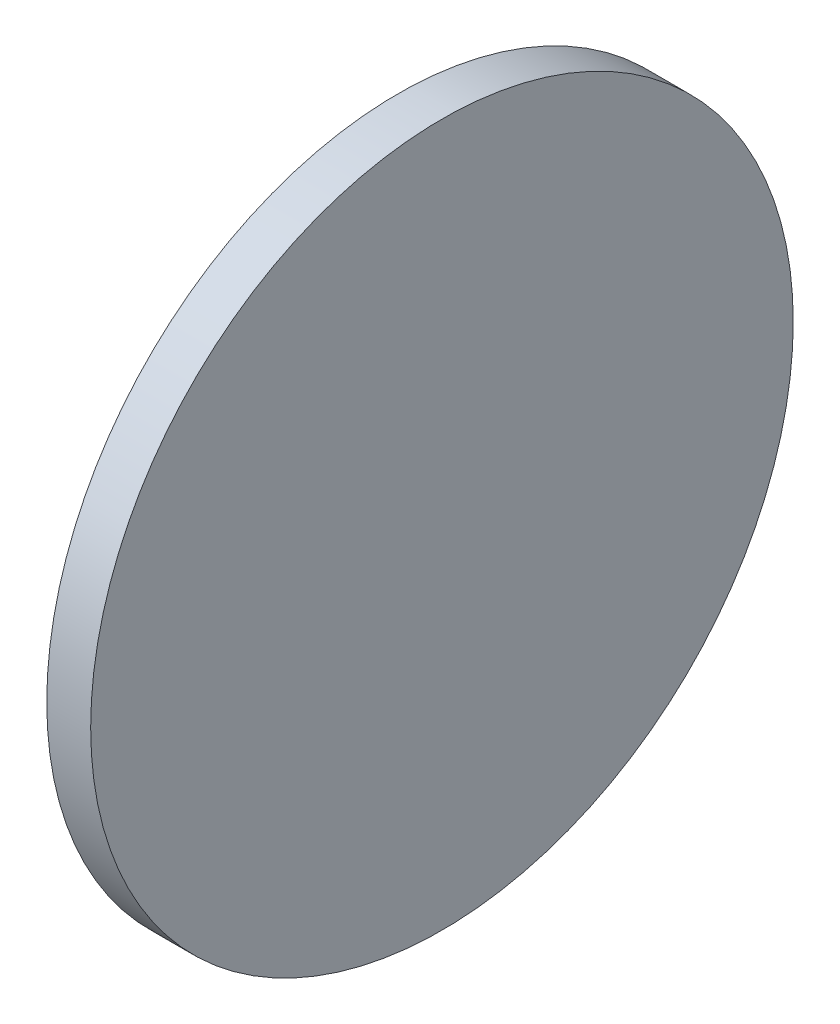
ISO-10303-21;
HEADER;
FILE_DESCRIPTION(('STEP AP214'),'2;1');
FILE_NAME('part.step','',(''),(''),'','','');
FILE_SCHEMA(('AUTOMOTIVE_DESIGN { 1 0 10303 214 1 1 1 1 }'));
ENDSEC;
DATA;
#1=APPLICATION_CONTEXT('core data for automotive mechanical design processes');
#2=APPLICATION_PROTOCOL_DEFINITION('international standard','automotive_design',2000,#1);
#3=PRODUCT_CONTEXT('',#1,'mechanical');
#4=PRODUCT('Part','Part','',(#3));
#5=PRODUCT_RELATED_PRODUCT_CATEGORY('part','',(#4));
#6=PRODUCT_DEFINITION_FORMATION('','',#4);
#7=PRODUCT_DEFINITION_CONTEXT('part definition',#1,'design');
#8=PRODUCT_DEFINITION('design','',#6,#7);
#9=PRODUCT_DEFINITION_SHAPE('','',#8);
#10=(LENGTH_UNIT() NAMED_UNIT(*) SI_UNIT(.MILLI.,.METRE.));
#11=(NAMED_UNIT(*) PLANE_ANGLE_UNIT() SI_UNIT($,.RADIAN.));
#12=(NAMED_UNIT(*) SI_UNIT($,.STERADIAN.) SOLID_ANGLE_UNIT());
#13=UNCERTAINTY_MEASURE_WITH_UNIT(LENGTH_MEASURE(1.E-05),#10,'distance_accuracy_value','');
#14=(GEOMETRIC_REPRESENTATION_CONTEXT(3) GLOBAL_UNCERTAINTY_ASSIGNED_CONTEXT((#13)) GLOBAL_UNIT_ASSIGNED_CONTEXT((#10,
#11,#12)) REPRESENTATION_CONTEXT('',''));
#15=CARTESIAN_POINT('',(0.,0.,0.));
#16=DIRECTION('',(0.,0.,1.));
#17=DIRECTION('',(1.,0.,0.));
#18=AXIS2_PLACEMENT_3D('',#15,#16,#17);
#19=CARTESIAN_POINT('',(168.7,25.4,0.));
#20=DIRECTION('',(1.,0.,0.));
#21=DIRECTION('',(0.,0.,-1.));
#22=AXIS2_PLACEMENT_3D('',#19,#20,#21);
#23=PLANE('',#22);
#24=CARTESIAN_POINT('',(168.7,0.,0.));
#25=DIRECTION('',(-1.,0.,0.));
#26=DIRECTION('',(0.,0.,1.));
#27=AXIS2_PLACEMENT_3D('',#24,#25,#26);
#28=CIRCLE('',#27,25.4);
#29=CARTESIAN_POINT('',(168.7,0.,25.4));
#30=VERTEX_POINT('',#29);
#31=EDGE_CURVE('E37',#30,#30,#28,.T.);
#32=ORIENTED_EDGE('',*,*,#31,.T.);
#33=EDGE_LOOP('',(#32));
#34=FACE_BOUND('',#33,.T.);
#35=ADVANCED_FACE('F31',(#34),#23,.F.);
#36=CARTESIAN_POINT('',(171.875,0.,0.));
#37=DIRECTION('',(-1.,0.,0.));
#38=DIRECTION('',(0.,0.,1.));
#39=AXIS2_PLACEMENT_3D('',#36,#37,#38);
#40=PLANE('',#39);
#41=CARTESIAN_POINT('',(171.875,0.,0.));
#42=DIRECTION('',(-1.,0.,0.));
#43=DIRECTION('',(0.,0.,1.));
#44=AXIS2_PLACEMENT_3D('',#41,#42,#43);
#45=CIRCLE('',#44,25.4);
#46=CARTESIAN_POINT('',(171.875,0.,25.4));
#47=VERTEX_POINT('',#46);
#48=EDGE_CURVE('E10',#47,#47,#45,.T.);
#49=ORIENTED_EDGE('',*,*,#48,.F.);
#50=EDGE_LOOP('',(#49));
#51=FACE_BOUND('',#50,.T.);
#52=ADVANCED_FACE('F46',(#51),#40,.F.);
#53=CARTESIAN_POINT('',(-110.,0.,0.));
#54=DIRECTION('',(-1.,0.,0.));
#55=DIRECTION('',(0.,0.,1.));
#56=AXIS2_PLACEMENT_3D('',#53,#54,#55);
#57=CYLINDRICAL_SURFACE('',#56,25.4);
#58=ORIENTED_EDGE('',*,*,#31,.F.);
#59=EDGE_LOOP('',(#58));
#60=FACE_BOUND('',#59,.T.);
#61=ORIENTED_EDGE('',*,*,#48,.T.);
#62=EDGE_LOOP('',(#61));
#63=FACE_BOUND('',#62,.T.);
#64=ADVANCED_FACE('F44',(#60,#63),#57,.T.);
#65=CLOSED_SHELL('',(#35,#52,#64));
#66=MANIFOLD_SOLID_BREP('B2',#65);
#67=ADVANCED_BREP_SHAPE_REPRESENTATION('',(#18,#66),#14);
#68=SHAPE_DEFINITION_REPRESENTATION(#9,#67);
ENDSEC;
END-ISO-10303-21;
